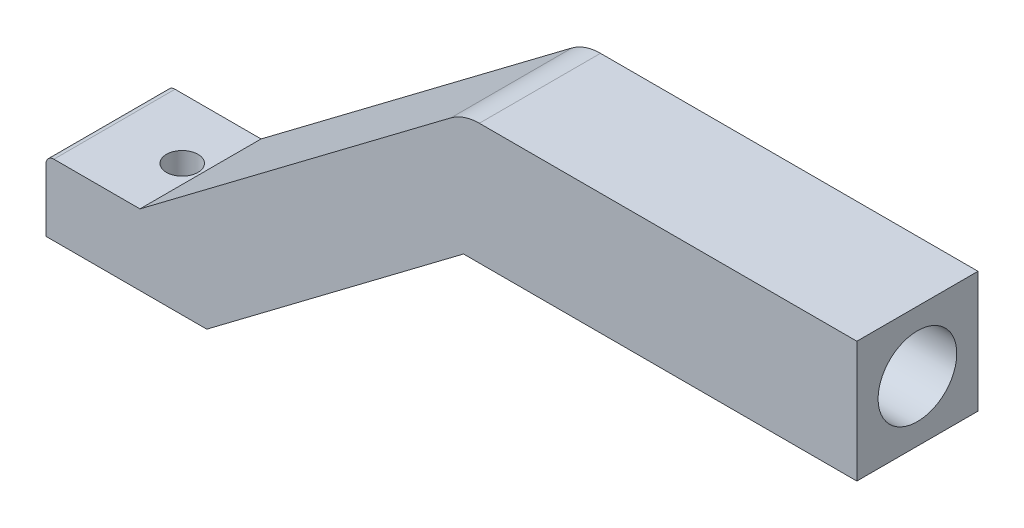
ISO-10303-21;
HEADER;
FILE_DESCRIPTION(('STEP AP214'),'2;1');
FILE_NAME('part.step','',(''),(''),'','','');
FILE_SCHEMA(('AUTOMOTIVE_DESIGN { 1 0 10303 214 1 1 1 1 }'));
ENDSEC;
DATA;
#1=APPLICATION_CONTEXT('core data for automotive mechanical design processes');
#2=APPLICATION_PROTOCOL_DEFINITION('international standard','automotive_design',2000,#1);
#3=PRODUCT_CONTEXT('',#1,'mechanical');
#4=PRODUCT('Part','Part','',(#3));
#5=PRODUCT_RELATED_PRODUCT_CATEGORY('part','',(#4));
#6=PRODUCT_DEFINITION_FORMATION('','',#4);
#7=PRODUCT_DEFINITION_CONTEXT('part definition',#1,'design');
#8=PRODUCT_DEFINITION('design','',#6,#7);
#9=PRODUCT_DEFINITION_SHAPE('','',#8);
#10=(LENGTH_UNIT() NAMED_UNIT(*) SI_UNIT(.MILLI.,.METRE.));
#11=(NAMED_UNIT(*) PLANE_ANGLE_UNIT() SI_UNIT($,.RADIAN.));
#12=(NAMED_UNIT(*) SI_UNIT($,.STERADIAN.) SOLID_ANGLE_UNIT());
#13=UNCERTAINTY_MEASURE_WITH_UNIT(LENGTH_MEASURE(1.E-05),#10,'distance_accuracy_value','');
#14=(GEOMETRIC_REPRESENTATION_CONTEXT(3) GLOBAL_UNCERTAINTY_ASSIGNED_CONTEXT((#13)) GLOBAL_UNIT_ASSIGNED_CONTEXT((#10,
#11,#12)) REPRESENTATION_CONTEXT('',''));
#15=CARTESIAN_POINT('',(0.,0.,0.));
#16=DIRECTION('',(0.,0.,1.));
#17=DIRECTION('',(1.,0.,0.));
#18=AXIS2_PLACEMENT_3D('',#15,#16,#17);
#19=CARTESIAN_POINT('',(-10.2182451264771,0.,7.7));
#20=DIRECTION('',(0.,1.,0.));
#21=DIRECTION('',(-1.,0.,0.));
#22=AXIS2_PLACEMENT_3D('',#19,#20,#21);
#23=PLANE('',#22);
#24=CARTESIAN_POINT('',(-5.40912256323856,0.,3.85));
#25=DIRECTION('',(0.,-1.,0.));
#26=DIRECTION('',(1.,0.,0.));
#27=AXIS2_PLACEMENT_3D('',#24,#25,#26);
#28=CIRCLE('',#27,1.);
#29=CARTESIAN_POINT('',(-4.40912256323856,0.,3.85));
#30=VERTEX_POINT('',#29);
#31=EDGE_CURVE('E173',#30,#30,#28,.T.);
#32=ORIENTED_EDGE('',*,*,#31,.F.);
#33=EDGE_LOOP('',(#32));
#34=FACE_BOUND('',#33,.T.);
#35=DIRECTION('',(1.,0.,0.));
#36=VECTOR('',#35,1.);
#37=CARTESIAN_POINT('',(-10.2182451264771,0.,0.));
#38=LINE('',#37,#36);
#39=CARTESIAN_POINT('',(-10.2182451264771,0.,0.));
#40=VERTEX_POINT('',#39);
#41=CARTESIAN_POINT('',(0.,0.,0.));
#42=VERTEX_POINT('',#41);
#43=EDGE_CURVE('E145',#40,#42,#38,.T.);
#44=ORIENTED_EDGE('',*,*,#43,.T.);
#45=DIRECTION('',(0.,0.,-1.));
#46=VECTOR('',#45,1.);
#47=CARTESIAN_POINT('',(0.,0.,7.7));
#48=LINE('',#47,#46);
#49=CARTESIAN_POINT('',(0.,0.,7.7));
#50=VERTEX_POINT('',#49);
#51=EDGE_CURVE('E124',#50,#42,#48,.T.);
#52=ORIENTED_EDGE('',*,*,#51,.F.);
#53=DIRECTION('',(1.,0.,0.));
#54=VECTOR('',#53,1.);
#55=CARTESIAN_POINT('',(-10.2182451264771,0.,7.7));
#56=LINE('',#55,#54);
#57=CARTESIAN_POINT('',(-10.2182451264771,0.,7.7));
#58=VERTEX_POINT('',#57);
#59=EDGE_CURVE('E132',#58,#50,#56,.T.);
#60=ORIENTED_EDGE('',*,*,#59,.F.);
#61=DIRECTION('',(0.,0.,-1.));
#62=VECTOR('',#61,1.);
#63=CARTESIAN_POINT('',(-10.2182451264771,0.,7.7));
#64=LINE('',#63,#62);
#65=EDGE_CURVE('E202',#58,#40,#64,.T.);
#66=ORIENTED_EDGE('',*,*,#65,.T.);
#67=EDGE_LOOP('',(#44,#52,#60,#66));
#68=FACE_BOUND('',#67,.T.);
#69=ADVANCED_FACE('F42',(#34,#68),#23,.F.);
#70=CARTESIAN_POINT('',(0.,0.,7.7));
#71=DIRECTION('',(-0.60181502315205,0.798635510047292,0.));
#72=DIRECTION('',(-0.798635510047292,-0.60181502315205,0.));
#73=AXIS2_PLACEMENT_3D('',#70,#71,#72);
#74=PLANE('',#73);
#75=DIRECTION('',(0.798635510047292,0.60181502315205,0.));
#76=VECTOR('',#75,1.);
#77=CARTESIAN_POINT('',(0.,0.,0.));
#78=LINE('',#77,#76);
#79=CARTESIAN_POINT('',(16.322651305931,12.3,0.));
#80=VERTEX_POINT('',#79);
#81=EDGE_CURVE('E235',#42,#80,#78,.T.);
#82=ORIENTED_EDGE('',*,*,#81,.T.);
#83=DIRECTION('',(0.,0.,-1.));
#84=VECTOR('',#83,1.);
#85=CARTESIAN_POINT('',(16.322651305931,12.3,7.7));
#86=LINE('',#85,#84);
#87=CARTESIAN_POINT('',(16.322651305931,12.3,7.7));
#88=VERTEX_POINT('',#87);
#89=EDGE_CURVE('E127',#88,#80,#86,.T.);
#90=ORIENTED_EDGE('',*,*,#89,.F.);
#91=DIRECTION('',(0.798635510047292,0.60181502315205,0.));
#92=VECTOR('',#91,1.);
#93=CARTESIAN_POINT('',(0.,0.,7.7));
#94=LINE('',#93,#92);
#95=EDGE_CURVE('E120',#50,#88,#94,.T.);
#96=ORIENTED_EDGE('',*,*,#95,.F.);
#97=ORIENTED_EDGE('',*,*,#51,.T.);
#98=EDGE_LOOP('',(#82,#90,#96,#97));
#99=FACE_BOUND('',#98,.T.);
#100=ADVANCED_FACE('F122',(#99),#74,.F.);
#101=CARTESIAN_POINT('',(16.322651305931,12.3,7.7));
#102=DIRECTION('',(0.,1.,0.));
#103=DIRECTION('',(0.,0.,1.));
#104=AXIS2_PLACEMENT_3D('',#101,#102,#103);
#105=PLANE('',#104);
#106=DIRECTION('',(1.,0.,0.));
#107=VECTOR('',#106,1.);
#108=CARTESIAN_POINT('',(16.322651305931,12.3,0.));
#109=LINE('',#108,#107);
#110=CARTESIAN_POINT('',(41.322651305931,12.3,0.));
#111=VERTEX_POINT('',#110);
#112=EDGE_CURVE('E226',#80,#111,#109,.T.);
#113=ORIENTED_EDGE('',*,*,#112,.T.);
#114=DIRECTION('',(0.,0.,-1.));
#115=VECTOR('',#114,1.);
#116=CARTESIAN_POINT('',(41.322651305931,12.3,7.7));
#117=LINE('',#116,#115);
#118=CARTESIAN_POINT('',(41.322651305931,12.3,7.7));
#119=VERTEX_POINT('',#118);
#120=EDGE_CURVE('E155',#119,#111,#117,.T.);
#121=ORIENTED_EDGE('',*,*,#120,.F.);
#122=DIRECTION('',(1.,0.,0.));
#123=VECTOR('',#122,1.);
#124=CARTESIAN_POINT('',(16.322651305931,12.3,7.7));
#125=LINE('',#124,#123);
#126=EDGE_CURVE('E131',#88,#119,#125,.T.);
#127=ORIENTED_EDGE('',*,*,#126,.F.);
#128=ORIENTED_EDGE('',*,*,#89,.T.);
#129=EDGE_LOOP('',(#113,#121,#127,#128));
#130=FACE_BOUND('',#129,.T.);
#131=ADVANCED_FACE('F263',(#130),#105,.F.);
#132=CARTESIAN_POINT('',(41.322651305931,20.,7.7));
#133=DIRECTION('',(-1.,0.,0.));
#134=DIRECTION('',(0.,0.,1.));
#135=AXIS2_PLACEMENT_3D('',#132,#133,#134);
#136=PLANE('',#135);
#137=CARTESIAN_POINT('',(41.322651305931,16.15,3.85));
#138=DIRECTION('',(1.,0.,0.));
#139=DIRECTION('',(0.,1.,0.));
#140=AXIS2_PLACEMENT_3D('',#137,#138,#139);
#141=CIRCLE('',#140,2.5);
#142=CARTESIAN_POINT('',(41.322651305931,18.65,3.85));
#143=VERTEX_POINT('',#142);
#144=EDGE_CURVE('E172',#143,#143,#141,.T.);
#145=ORIENTED_EDGE('',*,*,#144,.F.);
#146=EDGE_LOOP('',(#145));
#147=FACE_BOUND('',#146,.T.);
#148=DIRECTION('',(0.,1.,0.));
#149=VECTOR('',#148,1.);
#150=CARTESIAN_POINT('',(41.322651305931,20.,0.));
#151=LINE('',#150,#149);
#152=CARTESIAN_POINT('',(41.322651305931,20.,0.));
#153=VERTEX_POINT('',#152);
#154=EDGE_CURVE('E221',#111,#153,#151,.T.);
#155=ORIENTED_EDGE('',*,*,#154,.T.);
#156=DIRECTION('',(0.,0.,-1.));
#157=VECTOR('',#156,1.);
#158=CARTESIAN_POINT('',(41.322651305931,20.,7.7));
#159=LINE('',#158,#157);
#160=CARTESIAN_POINT('',(41.322651305931,20.,7.7));
#161=VERTEX_POINT('',#160);
#162=EDGE_CURVE('E209',#161,#153,#159,.T.);
#163=ORIENTED_EDGE('',*,*,#162,.F.);
#164=DIRECTION('',(0.,1.,0.));
#165=VECTOR('',#164,1.);
#166=CARTESIAN_POINT('',(41.322651305931,20.,7.7));
#167=LINE('',#166,#165);
#168=EDGE_CURVE('E222',#119,#161,#167,.T.);
#169=ORIENTED_EDGE('',*,*,#168,.F.);
#170=ORIENTED_EDGE('',*,*,#120,.T.);
#171=EDGE_LOOP('',(#155,#163,#169,#170));
#172=FACE_BOUND('',#171,.T.);
#173=ADVANCED_FACE('F219',(#147,#172),#136,.F.);
#174=CARTESIAN_POINT('',(41.322651305931,20.,7.7));
#175=DIRECTION('',(0.,-1.,0.));
#176=DIRECTION('',(0.,0.,-1.));
#177=AXIS2_PLACEMENT_3D('',#174,#175,#176);
#178=PLANE('',#177);
#179=DIRECTION('',(-1.,0.,0.));
#180=VECTOR('',#179,1.);
#181=CARTESIAN_POINT('',(41.322651305931,20.,0.));
#182=LINE('',#181,#180);
#183=CARTESIAN_POINT('',(17.3264372644372,20.,0.));
#184=VERTEX_POINT('',#183);
#185=EDGE_CURVE('E228',#153,#184,#182,.T.);
#186=ORIENTED_EDGE('',*,*,#185,.T.);
#187=DIRECTION('',(0.,0.,-1.));
#188=VECTOR('',#187,1.);
#189=CARTESIAN_POINT('',(17.3264372644372,20.,7.7));
#190=LINE('',#189,#188);
#191=CARTESIAN_POINT('',(17.3264372644372,20.,7.7));
#192=VERTEX_POINT('',#191);
#193=EDGE_CURVE('E161',#184,#192,#190,.F.);
#194=ORIENTED_EDGE('',*,*,#193,.T.);
#195=DIRECTION('',(-1.,0.,0.));
#196=VECTOR('',#195,1.);
#197=CARTESIAN_POINT('',(41.322651305931,20.,7.7));
#198=LINE('',#197,#196);
#199=EDGE_CURVE('E255',#161,#192,#198,.T.);
#200=ORIENTED_EDGE('',*,*,#199,.F.);
#201=ORIENTED_EDGE('',*,*,#162,.T.);
#202=EDGE_LOOP('',(#186,#194,#200,#201));
#203=FACE_BOUND('',#202,.T.);
#204=ADVANCED_FACE('F278',(#203),#178,.F.);
#205=CARTESIAN_POINT('',(16.322651305931,20.,7.7));
#206=DIRECTION('',(0.60181502315205,-0.798635510047292,0.));
#207=DIRECTION('',(0.798635510047292,0.60181502315205,0.));
#208=AXIS2_PLACEMENT_3D('',#205,#206,#207);
#209=PLANE('',#208);
#210=DIRECTION('',(-0.798635510047292,-0.60181502315205,0.));
#211=VECTOR('',#210,1.);
#212=CARTESIAN_POINT('',(16.322651305931,20.,7.7));
#213=LINE('',#212,#211);
#214=CARTESIAN_POINT('',(15.520992194981,19.3959065301419,7.7));
#215=VERTEX_POINT('',#214);
#216=CARTESIAN_POINT('',(-4.24654342918528,4.5,7.7));
#217=VERTEX_POINT('',#216);
#218=EDGE_CURVE('E249',#215,#217,#213,.T.);
#219=ORIENTED_EDGE('',*,*,#218,.F.);
#220=DIRECTION('',(0.,0.,-1.));
#221=VECTOR('',#220,1.);
#222=CARTESIAN_POINT('',(15.520992194981,19.3959065301419,7.7));
#223=LINE('',#222,#221);
#224=CARTESIAN_POINT('',(15.520992194981,19.3959065301419,0.));
#225=VERTEX_POINT('',#224);
#226=EDGE_CURVE('E147',#215,#225,#223,.T.);
#227=ORIENTED_EDGE('',*,*,#226,.T.);
#228=DIRECTION('',(-0.798635510047292,-0.60181502315205,0.));
#229=VECTOR('',#228,1.);
#230=CARTESIAN_POINT('',(16.322651305931,20.,0.));
#231=LINE('',#230,#229);
#232=CARTESIAN_POINT('',(-4.24654342918528,4.5,0.));
#233=VERTEX_POINT('',#232);
#234=EDGE_CURVE('E198',#225,#233,#231,.T.);
#235=ORIENTED_EDGE('',*,*,#234,.T.);
#236=DIRECTION('',(0.,0.,-1.));
#237=VECTOR('',#236,1.);
#238=CARTESIAN_POINT('',(-4.24654342918528,4.5,7.7));
#239=LINE('',#238,#237);
#240=EDGE_CURVE('E205',#217,#233,#239,.T.);
#241=ORIENTED_EDGE('',*,*,#240,.F.);
#242=EDGE_LOOP('',(#219,#227,#235,#241));
#243=FACE_BOUND('',#242,.T.);
#244=ADVANCED_FACE('F244',(#243),#209,.F.);
#245=CARTESIAN_POINT('',(-4.24654342918528,4.5,7.7));
#246=DIRECTION('',(0.,-1.,0.));
#247=DIRECTION('',(1.,0.,0.));
#248=AXIS2_PLACEMENT_3D('',#245,#246,#247);
#249=PLANE('',#248);
#250=CARTESIAN_POINT('',(-5.40912256323856,4.5,3.85));
#251=DIRECTION('',(0.,-1.,0.));
#252=DIRECTION('',(1.,0.,0.));
#253=AXIS2_PLACEMENT_3D('',#250,#251,#252);
#254=CIRCLE('',#253,1.);
#255=CARTESIAN_POINT('',(-4.40912256323856,4.5,3.85));
#256=VERTEX_POINT('',#255);
#257=EDGE_CURVE('E168',#256,#256,#254,.T.);
#258=ORIENTED_EDGE('',*,*,#257,.T.);
#259=EDGE_LOOP('',(#258));
#260=FACE_BOUND('',#259,.T.);
#261=DIRECTION('',(-1.,0.,0.));
#262=VECTOR('',#261,1.);
#263=CARTESIAN_POINT('',(-4.24654342918528,4.5,0.));
#264=LINE('',#263,#262);
#265=CARTESIAN_POINT('',(-9.71824512647711,4.5,0.));
#266=VERTEX_POINT('',#265);
#267=EDGE_CURVE('E194',#233,#266,#264,.T.);
#268=ORIENTED_EDGE('',*,*,#267,.T.);
#269=DIRECTION('',(0.,0.,-1.));
#270=VECTOR('',#269,1.);
#271=CARTESIAN_POINT('',(-9.71824512647711,4.5,7.7));
#272=LINE('',#271,#270);
#273=CARTESIAN_POINT('',(-9.71824512647711,4.5,7.7));
#274=VERTEX_POINT('',#273);
#275=EDGE_CURVE('E51',#266,#274,#272,.F.);
#276=ORIENTED_EDGE('',*,*,#275,.T.);
#277=DIRECTION('',(-1.,0.,0.));
#278=VECTOR('',#277,1.);
#279=CARTESIAN_POINT('',(-4.24654342918528,4.5,7.7));
#280=LINE('',#279,#278);
#281=EDGE_CURVE('E247',#217,#274,#280,.T.);
#282=ORIENTED_EDGE('',*,*,#281,.F.);
#283=ORIENTED_EDGE('',*,*,#240,.T.);
#284=EDGE_LOOP('',(#268,#276,#282,#283));
#285=FACE_BOUND('',#284,.T.);
#286=ADVANCED_FACE('F246',(#260,#285),#249,.F.);
#287=CARTESIAN_POINT('',(-10.2182451264771,4.5,7.7));
#288=DIRECTION('',(1.,0.,0.));
#289=DIRECTION('',(0.,0.,-1.));
#290=AXIS2_PLACEMENT_3D('',#287,#288,#289);
#291=PLANE('',#290);
#292=DIRECTION('',(0.,-1.,0.));
#293=VECTOR('',#292,1.);
#294=CARTESIAN_POINT('',(-10.2182451264771,4.5,7.7));
#295=LINE('',#294,#293);
#296=CARTESIAN_POINT('',(-10.2182451264771,4.,7.7));
#297=VERTEX_POINT('',#296);
#298=EDGE_CURVE('E137',#297,#58,#295,.T.);
#299=ORIENTED_EDGE('',*,*,#298,.F.);
#300=DIRECTION('',(0.,0.,-1.));
#301=VECTOR('',#300,1.);
#302=CARTESIAN_POINT('',(-10.2182451264771,4.,7.7));
#303=LINE('',#302,#301);
#304=CARTESIAN_POINT('',(-10.2182451264771,4.,0.));
#305=VERTEX_POINT('',#304);
#306=EDGE_CURVE('E167',#297,#305,#303,.T.);
#307=ORIENTED_EDGE('',*,*,#306,.T.);
#308=DIRECTION('',(0.,-1.,0.));
#309=VECTOR('',#308,1.);
#310=CARTESIAN_POINT('',(-10.2182451264771,4.5,0.));
#311=LINE('',#310,#309);
#312=EDGE_CURVE('E142',#305,#40,#311,.T.);
#313=ORIENTED_EDGE('',*,*,#312,.T.);
#314=ORIENTED_EDGE('',*,*,#65,.F.);
#315=EDGE_LOOP('',(#299,#307,#313,#314));
#316=FACE_BOUND('',#315,.T.);
#317=ADVANCED_FACE('F189',(#316),#291,.F.);
#318=CARTESIAN_POINT('',(0.,0.,7.7));
#319=DIRECTION('',(0.,0.,-1.));
#320=DIRECTION('',(-1.,0.,0.));
#321=AXIS2_PLACEMENT_3D('',#318,#319,#320);
#322=PLANE('',#321);
#323=ORIENTED_EDGE('',*,*,#281,.T.);
#324=CARTESIAN_POINT('',(-9.71824512647711,4.,7.7));
#325=DIRECTION('',(0.,0.,-1.));
#326=DIRECTION('',(-1.,0.,0.));
#327=AXIS2_PLACEMENT_3D('',#324,#325,#326);
#328=CIRCLE('',#327,0.5);
#329=EDGE_CURVE('E12',#274,#297,#328,.F.);
#330=ORIENTED_EDGE('',*,*,#329,.T.);
#331=ORIENTED_EDGE('',*,*,#298,.T.);
#332=ORIENTED_EDGE('',*,*,#59,.T.);
#333=ORIENTED_EDGE('',*,*,#95,.T.);
#334=ORIENTED_EDGE('',*,*,#126,.T.);
#335=ORIENTED_EDGE('',*,*,#168,.T.);
#336=ORIENTED_EDGE('',*,*,#199,.T.);
#337=CARTESIAN_POINT('',(17.3264372644372,17.,7.7));
#338=DIRECTION('',(0.,0.,-1.));
#339=DIRECTION('',(-1.,0.,0.));
#340=AXIS2_PLACEMENT_3D('',#337,#338,#339);
#341=CIRCLE('',#340,3.);
#342=EDGE_CURVE('E164',#192,#215,#341,.F.);
#343=ORIENTED_EDGE('',*,*,#342,.T.);
#344=ORIENTED_EDGE('',*,*,#218,.T.);
#345=EDGE_LOOP('',(#323,#330,#331,#332,#333,#334,#335,#336,#343,#344));
#346=FACE_BOUND('',#345,.T.);
#347=ADVANCED_FACE('F135',(#346),#322,.F.);
#348=CARTESIAN_POINT('',(0.,0.,0.));
#349=DIRECTION('',(0.,0.,-1.));
#350=DIRECTION('',(-1.,0.,0.));
#351=AXIS2_PLACEMENT_3D('',#348,#349,#350);
#352=PLANE('',#351);
#353=ORIENTED_EDGE('',*,*,#312,.F.);
#354=CARTESIAN_POINT('',(-9.71824512647711,4.,0.));
#355=DIRECTION('',(0.,0.,-1.));
#356=DIRECTION('',(-1.,0.,0.));
#357=AXIS2_PLACEMENT_3D('',#354,#355,#356);
#358=CIRCLE('',#357,0.5);
#359=EDGE_CURVE('E65',#305,#266,#358,.T.);
#360=ORIENTED_EDGE('',*,*,#359,.T.);
#361=ORIENTED_EDGE('',*,*,#267,.F.);
#362=ORIENTED_EDGE('',*,*,#234,.F.);
#363=CARTESIAN_POINT('',(17.3264372644372,17.,0.));
#364=DIRECTION('',(0.,0.,-1.));
#365=DIRECTION('',(-1.,0.,0.));
#366=AXIS2_PLACEMENT_3D('',#363,#364,#365);
#367=CIRCLE('',#366,3.);
#368=EDGE_CURVE('E153',#225,#184,#367,.T.);
#369=ORIENTED_EDGE('',*,*,#368,.T.);
#370=ORIENTED_EDGE('',*,*,#185,.F.);
#371=ORIENTED_EDGE('',*,*,#154,.F.);
#372=ORIENTED_EDGE('',*,*,#112,.F.);
#373=ORIENTED_EDGE('',*,*,#81,.F.);
#374=ORIENTED_EDGE('',*,*,#43,.F.);
#375=EDGE_LOOP('',(#353,#360,#361,#362,#369,#370,#371,#372,#373,#374));
#376=FACE_BOUND('',#375,.T.);
#377=ADVANCED_FACE('F192',(#376),#352,.T.);
#378=CARTESIAN_POINT('',(17.3264372644372,17.,7.7));
#379=DIRECTION('',(0.,0.,-1.));
#380=DIRECTION('',(-1.,0.,0.));
#381=AXIS2_PLACEMENT_3D('',#378,#379,#380);
#382=CYLINDRICAL_SURFACE('',#381,3.);
#383=ORIENTED_EDGE('',*,*,#342,.F.);
#384=ORIENTED_EDGE('',*,*,#193,.F.);
#385=ORIENTED_EDGE('',*,*,#368,.F.);
#386=ORIENTED_EDGE('',*,*,#226,.F.);
#387=EDGE_LOOP('',(#383,#384,#385,#386));
#388=FACE_BOUND('',#387,.T.);
#389=ADVANCED_FACE('F277',(#388),#382,.T.);
#390=CARTESIAN_POINT('',(31.322651305931,16.15,3.85));
#391=DIRECTION('',(1.,0.,0.));
#392=DIRECTION('',(0.,1.,0.));
#393=AXIS2_PLACEMENT_3D('',#390,#391,#392);
#394=CYLINDRICAL_SURFACE('',#393,2.5);
#395=CARTESIAN_POINT('',(31.322651305931,16.15,3.85));
#396=DIRECTION('',(1.,0.,0.));
#397=DIRECTION('',(0.,1.,0.));
#398=AXIS2_PLACEMENT_3D('',#395,#396,#397);
#399=CIRCLE('',#398,2.5);
#400=CARTESIAN_POINT('',(31.322651305931,18.65,3.85));
#401=VERTEX_POINT('',#400);
#402=EDGE_CURVE('E260',#401,#401,#399,.T.);
#403=ORIENTED_EDGE('',*,*,#402,.F.);
#404=EDGE_LOOP('',(#403));
#405=FACE_BOUND('',#404,.T.);
#406=ORIENTED_EDGE('',*,*,#144,.T.);
#407=EDGE_LOOP('',(#406));
#408=FACE_BOUND('',#407,.T.);
#409=ADVANCED_FACE('F298',(#405,#408),#394,.F.);
#410=CARTESIAN_POINT('',(31.322651305931,16.15,3.85));
#411=DIRECTION('',(1.,0.,0.));
#412=DIRECTION('',(0.,1.,0.));
#413=AXIS2_PLACEMENT_3D('',#410,#411,#412);
#414=PLANE('',#413);
#415=ORIENTED_EDGE('',*,*,#402,.T.);
#416=EDGE_LOOP('',(#415));
#417=FACE_BOUND('',#416,.T.);
#418=ADVANCED_FACE('F303',(#417),#414,.T.);
#419=CARTESIAN_POINT('',(-5.40912256323856,20.,3.85));
#420=DIRECTION('',(0.,-1.,0.));
#421=DIRECTION('',(1.,0.,0.));
#422=AXIS2_PLACEMENT_3D('',#419,#420,#421);
#423=CYLINDRICAL_SURFACE('',#422,1.);
#424=ORIENTED_EDGE('',*,*,#31,.T.);
#425=EDGE_LOOP('',(#424));
#426=FACE_BOUND('',#425,.T.);
#427=ORIENTED_EDGE('',*,*,#257,.F.);
#428=EDGE_LOOP('',(#427));
#429=FACE_BOUND('',#428,.T.);
#430=ADVANCED_FACE('F320',(#426,#429),#423,.F.);
#431=CARTESIAN_POINT('',(-9.71824512647711,4.,7.7));
#432=DIRECTION('',(0.,0.,-1.));
#433=DIRECTION('',(-1.,0.,0.));
#434=AXIS2_PLACEMENT_3D('',#431,#432,#433);
#435=CYLINDRICAL_SURFACE('',#434,0.5);
#436=ORIENTED_EDGE('',*,*,#329,.F.);
#437=ORIENTED_EDGE('',*,*,#275,.F.);
#438=ORIENTED_EDGE('',*,*,#359,.F.);
#439=ORIENTED_EDGE('',*,*,#306,.F.);
#440=EDGE_LOOP('',(#436,#437,#438,#439));
#441=FACE_BOUND('',#440,.T.);
#442=ADVANCED_FACE('F44',(#441),#435,.T.);
#443=CLOSED_SHELL('',(#69,#100,#131,#173,#204,#244,#286,#317,#347,#377,#389,#409,#418,#430,#442));
#444=MANIFOLD_SOLID_BREP('B2',#443);
#445=ADVANCED_BREP_SHAPE_REPRESENTATION('',(#18,#444),#14);
#446=SHAPE_DEFINITION_REPRESENTATION(#9,#445);
ENDSEC;
END-ISO-10303-21;
